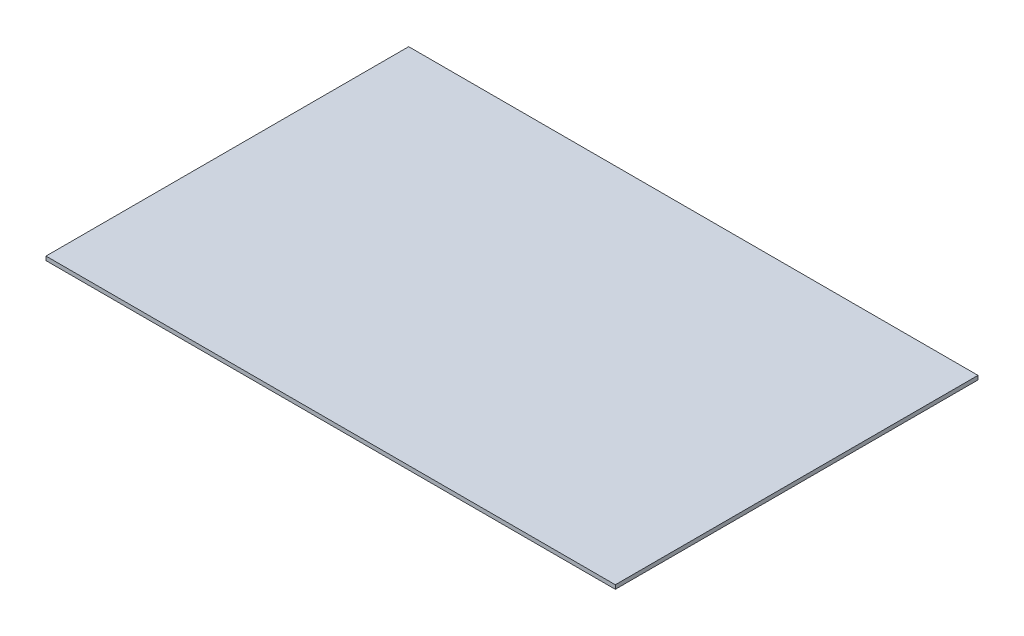
ISO-10303-21;
HEADER;
FILE_DESCRIPTION(('STEP AP214'),'2;1');
FILE_NAME('part.step','',(''),(''),'','','');
FILE_SCHEMA(('AUTOMOTIVE_DESIGN { 1 0 10303 214 1 1 1 1 }'));
ENDSEC;
DATA;
#1=APPLICATION_CONTEXT('core data for automotive mechanical design processes');
#2=APPLICATION_PROTOCOL_DEFINITION('international standard','automotive_design',2000,#1);
#3=PRODUCT_CONTEXT('',#1,'mechanical');
#4=PRODUCT('Part','Part','',(#3));
#5=PRODUCT_RELATED_PRODUCT_CATEGORY('part','',(#4));
#6=PRODUCT_DEFINITION_FORMATION('','',#4);
#7=PRODUCT_DEFINITION_CONTEXT('part definition',#1,'design');
#8=PRODUCT_DEFINITION('design','',#6,#7);
#9=PRODUCT_DEFINITION_SHAPE('','',#8);
#10=(LENGTH_UNIT() NAMED_UNIT(*) SI_UNIT(.MILLI.,.METRE.));
#11=(NAMED_UNIT(*) PLANE_ANGLE_UNIT() SI_UNIT($,.RADIAN.));
#12=(NAMED_UNIT(*) SI_UNIT($,.STERADIAN.) SOLID_ANGLE_UNIT());
#13=UNCERTAINTY_MEASURE_WITH_UNIT(LENGTH_MEASURE(1.E-05),#10,'distance_accuracy_value','');
#14=(GEOMETRIC_REPRESENTATION_CONTEXT(3) GLOBAL_UNCERTAINTY_ASSIGNED_CONTEXT((#13)) GLOBAL_UNIT_ASSIGNED_CONTEXT((#10,
#11,#12)) REPRESENTATION_CONTEXT('',''));
#15=CARTESIAN_POINT('',(0.,0.,0.));
#16=DIRECTION('',(0.,0.,1.));
#17=DIRECTION('',(1.,0.,0.));
#18=AXIS2_PLACEMENT_3D('',#15,#16,#17);
#19=CARTESIAN_POINT('',(-1428.5,20.,910.));
#20=DIRECTION('',(1.,0.,0.));
#21=DIRECTION('',(0.,0.,-1.));
#22=AXIS2_PLACEMENT_3D('',#19,#20,#21);
#23=PLANE('',#22);
#24=DIRECTION('',(0.,0.,1.));
#25=VECTOR('',#24,1.);
#26=CARTESIAN_POINT('',(-1428.5,0.,910.));
#27=LINE('',#26,#25);
#28=CARTESIAN_POINT('',(-1428.5,0.,-910.));
#29=VERTEX_POINT('',#28);
#30=CARTESIAN_POINT('',(-1428.5,0.,910.));
#31=VERTEX_POINT('',#30);
#32=EDGE_CURVE('E96',#29,#31,#27,.T.);
#33=ORIENTED_EDGE('',*,*,#32,.T.);
#34=DIRECTION('',(0.,-1.,0.));
#35=VECTOR('',#34,1.);
#36=CARTESIAN_POINT('',(-1428.5,20.,910.));
#37=LINE('',#36,#35);
#38=CARTESIAN_POINT('',(-1428.5,20.,910.));
#39=VERTEX_POINT('',#38);
#40=EDGE_CURVE('E11',#39,#31,#37,.T.);
#41=ORIENTED_EDGE('',*,*,#40,.F.);
#42=DIRECTION('',(0.,0.,1.));
#43=VECTOR('',#42,1.);
#44=CARTESIAN_POINT('',(-1428.5,20.,910.));
#45=LINE('',#44,#43);
#46=CARTESIAN_POINT('',(-1428.5,20.,-910.));
#47=VERTEX_POINT('',#46);
#48=EDGE_CURVE('E84',#47,#39,#45,.T.);
#49=ORIENTED_EDGE('',*,*,#48,.F.);
#50=DIRECTION('',(0.,-1.,0.));
#51=VECTOR('',#50,1.);
#52=CARTESIAN_POINT('',(-1428.5,20.,-910.));
#53=LINE('',#52,#51);
#54=EDGE_CURVE('E92',#47,#29,#53,.T.);
#55=ORIENTED_EDGE('',*,*,#54,.T.);
#56=EDGE_LOOP('',(#33,#41,#49,#55));
#57=FACE_BOUND('',#56,.T.);
#58=ADVANCED_FACE('F33',(#57),#23,.F.);
#59=CARTESIAN_POINT('',(1428.5,20.,910.));
#60=DIRECTION('',(0.,0.,-1.));
#61=DIRECTION('',(-1.,0.,0.));
#62=AXIS2_PLACEMENT_3D('',#59,#60,#61);
#63=PLANE('',#62);
#64=DIRECTION('',(1.,0.,0.));
#65=VECTOR('',#64,1.);
#66=CARTESIAN_POINT('',(1428.5,0.,910.));
#67=LINE('',#66,#65);
#68=CARTESIAN_POINT('',(1428.5,0.,910.));
#69=VERTEX_POINT('',#68);
#70=EDGE_CURVE('E88',#31,#69,#67,.T.);
#71=ORIENTED_EDGE('',*,*,#70,.T.);
#72=DIRECTION('',(0.,-1.,0.));
#73=VECTOR('',#72,1.);
#74=CARTESIAN_POINT('',(1428.5,20.,910.));
#75=LINE('',#74,#73);
#76=CARTESIAN_POINT('',(1428.5,20.,910.));
#77=VERTEX_POINT('',#76);
#78=EDGE_CURVE('E41',#77,#69,#75,.T.);
#79=ORIENTED_EDGE('',*,*,#78,.F.);
#80=DIRECTION('',(1.,0.,0.));
#81=VECTOR('',#80,1.);
#82=CARTESIAN_POINT('',(1428.5,20.,910.));
#83=LINE('',#82,#81);
#84=EDGE_CURVE('E79',#39,#77,#83,.T.);
#85=ORIENTED_EDGE('',*,*,#84,.F.);
#86=ORIENTED_EDGE('',*,*,#40,.T.);
#87=EDGE_LOOP('',(#71,#79,#85,#86));
#88=FACE_BOUND('',#87,.T.);
#89=ADVANCED_FACE('F87',(#88),#63,.F.);
#90=CARTESIAN_POINT('',(1428.5,20.,910.));
#91=DIRECTION('',(-1.,0.,0.));
#92=DIRECTION('',(0.,0.,1.));
#93=AXIS2_PLACEMENT_3D('',#90,#91,#92);
#94=PLANE('',#93);
#95=DIRECTION('',(0.,0.,-1.));
#96=VECTOR('',#95,1.);
#97=CARTESIAN_POINT('',(1428.5,0.,910.));
#98=LINE('',#97,#96);
#99=CARTESIAN_POINT('',(1428.5,0.,-910.));
#100=VERTEX_POINT('',#99);
#101=EDGE_CURVE('E66',#69,#100,#98,.T.);
#102=ORIENTED_EDGE('',*,*,#101,.T.);
#103=DIRECTION('',(0.,-1.,0.));
#104=VECTOR('',#103,1.);
#105=CARTESIAN_POINT('',(1428.5,20.,-910.));
#106=LINE('',#105,#104);
#107=CARTESIAN_POINT('',(1428.5,20.,-910.));
#108=VERTEX_POINT('',#107);
#109=EDGE_CURVE('E89',#108,#100,#106,.T.);
#110=ORIENTED_EDGE('',*,*,#109,.F.);
#111=DIRECTION('',(0.,0.,-1.));
#112=VECTOR('',#111,1.);
#113=CARTESIAN_POINT('',(1428.5,20.,910.));
#114=LINE('',#113,#112);
#115=EDGE_CURVE('E82',#77,#108,#114,.T.);
#116=ORIENTED_EDGE('',*,*,#115,.F.);
#117=ORIENTED_EDGE('',*,*,#78,.T.);
#118=EDGE_LOOP('',(#102,#110,#116,#117));
#119=FACE_BOUND('',#118,.T.);
#120=ADVANCED_FACE('F90',(#119),#94,.F.);
#121=CARTESIAN_POINT('',(1428.5,20.,-910.));
#122=DIRECTION('',(0.,0.,1.));
#123=DIRECTION('',(1.,0.,0.));
#124=AXIS2_PLACEMENT_3D('',#121,#122,#123);
#125=PLANE('',#124);
#126=DIRECTION('',(-1.,0.,0.));
#127=VECTOR('',#126,1.);
#128=CARTESIAN_POINT('',(1428.5,0.,-910.));
#129=LINE('',#128,#127);
#130=EDGE_CURVE('E72',#100,#29,#129,.T.);
#131=ORIENTED_EDGE('',*,*,#130,.T.);
#132=ORIENTED_EDGE('',*,*,#54,.F.);
#133=DIRECTION('',(-1.,0.,0.));
#134=VECTOR('',#133,1.);
#135=CARTESIAN_POINT('',(1428.5,20.,-910.));
#136=LINE('',#135,#134);
#137=EDGE_CURVE('E49',#108,#47,#136,.T.);
#138=ORIENTED_EDGE('',*,*,#137,.F.);
#139=ORIENTED_EDGE('',*,*,#109,.T.);
#140=EDGE_LOOP('',(#131,#132,#138,#139));
#141=FACE_BOUND('',#140,.T.);
#142=ADVANCED_FACE('F103',(#141),#125,.F.);
#143=CARTESIAN_POINT('',(0.,20.,0.));
#144=DIRECTION('',(0.,1.,0.));
#145=DIRECTION('',(0.,0.,1.));
#146=AXIS2_PLACEMENT_3D('',#143,#144,#145);
#147=PLANE('',#146);
#148=ORIENTED_EDGE('',*,*,#48,.T.);
#149=ORIENTED_EDGE('',*,*,#84,.T.);
#150=ORIENTED_EDGE('',*,*,#115,.T.);
#151=ORIENTED_EDGE('',*,*,#137,.T.);
#152=EDGE_LOOP('',(#148,#149,#150,#151));
#153=FACE_BOUND('',#152,.T.);
#154=ADVANCED_FACE('F80',(#153),#147,.T.);
#155=CARTESIAN_POINT('',(0.,0.,0.));
#156=DIRECTION('',(0.,1.,0.));
#157=DIRECTION('',(0.,0.,1.));
#158=AXIS2_PLACEMENT_3D('',#155,#156,#157);
#159=PLANE('',#158);
#160=ORIENTED_EDGE('',*,*,#32,.F.);
#161=ORIENTED_EDGE('',*,*,#130,.F.);
#162=ORIENTED_EDGE('',*,*,#101,.F.);
#163=ORIENTED_EDGE('',*,*,#70,.F.);
#164=EDGE_LOOP('',(#160,#161,#162,#163));
#165=FACE_BOUND('',#164,.T.);
#166=ADVANCED_FACE('F106',(#165),#159,.F.);
#167=CLOSED_SHELL('',(#58,#89,#120,#142,#154,#166));
#168=MANIFOLD_SOLID_BREP('B2',#167);
#169=ADVANCED_BREP_SHAPE_REPRESENTATION('',(#18,#168),#14);
#170=SHAPE_DEFINITION_REPRESENTATION(#9,#169);
ENDSEC;
END-ISO-10303-21;
